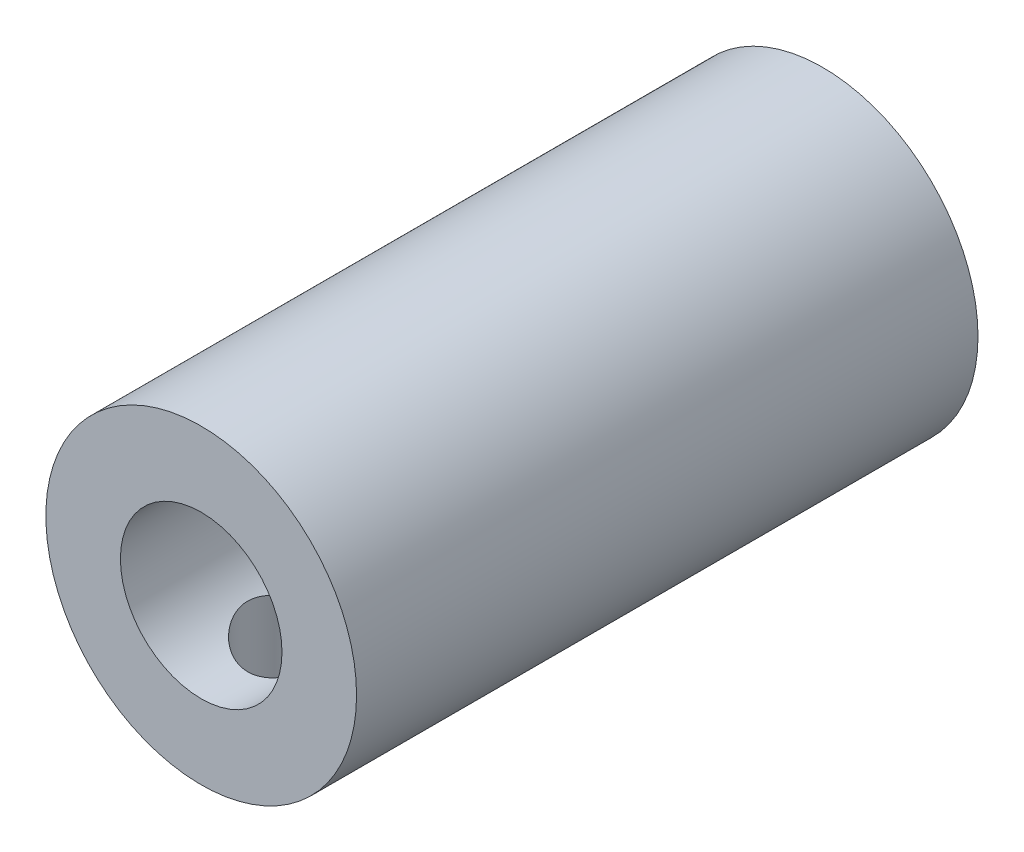
ISO-10303-21;
HEADER;
FILE_DESCRIPTION(('STEP AP214'),'2;1');
FILE_NAME('part.step','',(''),(''),'','','');
FILE_SCHEMA(('AUTOMOTIVE_DESIGN { 1 0 10303 214 1 1 1 1 }'));
ENDSEC;
DATA;
#1=APPLICATION_CONTEXT('core data for automotive mechanical design processes');
#2=APPLICATION_PROTOCOL_DEFINITION('international standard','automotive_design',2000,#1);
#3=PRODUCT_CONTEXT('',#1,'mechanical');
#4=PRODUCT('Part','Part','',(#3));
#5=PRODUCT_RELATED_PRODUCT_CATEGORY('part','',(#4));
#6=PRODUCT_DEFINITION_FORMATION('','',#4);
#7=PRODUCT_DEFINITION_CONTEXT('part definition',#1,'design');
#8=PRODUCT_DEFINITION('design','',#6,#7);
#9=PRODUCT_DEFINITION_SHAPE('','',#8);
#10=(LENGTH_UNIT() NAMED_UNIT(*) SI_UNIT(.MILLI.,.METRE.));
#11=(NAMED_UNIT(*) PLANE_ANGLE_UNIT() SI_UNIT($,.RADIAN.));
#12=(NAMED_UNIT(*) SI_UNIT($,.STERADIAN.) SOLID_ANGLE_UNIT());
#13=UNCERTAINTY_MEASURE_WITH_UNIT(LENGTH_MEASURE(1.E-05),#10,'distance_accuracy_value','');
#14=(GEOMETRIC_REPRESENTATION_CONTEXT(3) GLOBAL_UNCERTAINTY_ASSIGNED_CONTEXT((#13)) GLOBAL_UNIT_ASSIGNED_CONTEXT((#10,
#11,#12)) REPRESENTATION_CONTEXT('',''));
#15=CARTESIAN_POINT('',(0.,0.,0.));
#16=DIRECTION('',(0.,0.,1.));
#17=DIRECTION('',(1.,0.,0.));
#18=AXIS2_PLACEMENT_3D('',#15,#16,#17);
#19=CARTESIAN_POINT('',(0.,0.,20.));
#20=DIRECTION('',(0.,0.,-1.));
#21=DIRECTION('',(-1.,0.,0.));
#22=AXIS2_PLACEMENT_3D('',#19,#20,#21);
#23=CYLINDRICAL_SURFACE('',#22,10.);
#24=CARTESIAN_POINT('',(0.,-10.,-11.));
#25=CARTESIAN_POINT('',(0.164577225506601,-9.999998585011,-11.0000019949698));
#26=CARTESIAN_POINT('',(0.32917463670306,-9.99589831387907,-11.0135877272479));
#27=CARTESIAN_POINT('',(0.653576250609762,-9.97994211187382,-11.0674427084442));
#28=CARTESIAN_POINT('',(0.813379008822841,-9.96808386779384,-11.1077199160467));
#29=CARTESIAN_POINT('',(1.12346541550905,-9.93791105003673,-11.2134920338205));
#30=CARTESIAN_POINT('',(1.27376272879075,-9.91960600500851,-11.2789497392379));
#31=CARTESIAN_POINT('',(1.56124836210626,-9.87844218475291,-11.4330721861117));
#32=CARTESIAN_POINT('',(1.69843493493934,-9.85558280384133,-11.5217400147908));
#33=CARTESIAN_POINT('',(1.95974359436749,-9.80701474385548,-11.7224480149453));
#34=CARTESIAN_POINT('',(2.08343614248868,-9.78124767314073,-11.8350332517718));
#35=CARTESIAN_POINT('',(2.31049841846648,-9.73011668420884,-12.0792184598204));
#36=CARTESIAN_POINT('',(2.41386472654882,-9.70475283449003,-12.2108216242499));
#37=CARTESIAN_POINT('',(2.59960075447415,-9.65668227987544,-12.4929415060752));
#38=CARTESIAN_POINT('',(2.68144618044427,-9.63404813327749,-12.6438169219815));
#39=CARTESIAN_POINT('',(2.81842789549521,-9.59487240788062,-12.9579785084606));
#40=CARTESIAN_POINT('',(2.87357059839947,-9.57832936626621,-13.121261687856));
#41=CARTESIAN_POINT('',(2.95403267365303,-9.55381741676868,-13.4507805322609));
#42=CARTESIAN_POINT('',(2.98014392469355,-9.54562138649067,-13.6168054877279));
#43=CARTESIAN_POINT('',(3.00427461229344,-9.53805579499534,-13.9510663124335));
#44=CARTESIAN_POINT('',(3.00230085522157,-9.53868409521142,-14.1193016361182));
#45=CARTESIAN_POINT('',(2.97093954399623,-9.54849488135555,-14.446767817217));
#46=CARTESIAN_POINT('',(2.9425441052537,-9.55736777198281,-14.6061045007245));
#47=CARTESIAN_POINT('',(2.86074840854112,-9.58216712457248,-14.9176395725469));
#48=CARTESIAN_POINT('',(2.80734568283282,-9.59809428264701,-15.0698372547487));
#49=CARTESIAN_POINT('',(2.67632053307363,-9.63545466149946,-15.3652006993215));
#50=CARTESIAN_POINT('',(2.59837633869285,-9.65696032231904,-15.5082141679105));
#51=CARTESIAN_POINT('',(2.42070445177367,-9.70301974000129,-15.7794640440204));
#52=CARTESIAN_POINT('',(2.32097148005177,-9.72757423493982,-15.9076968588276));
#53=CARTESIAN_POINT('',(2.09762581531093,-9.77822022595875,-16.151372381524));
#54=CARTESIAN_POINT('',(1.97318981493395,-9.80433308620996,-16.2660573280593));
#55=CARTESIAN_POINT('',(1.70652651862793,-9.85424488126517,-16.4731079681285));
#56=CARTESIAN_POINT('',(1.56429810372178,-9.8780436703682,-16.5654722568289));
#57=CARTESIAN_POINT('',(1.26471007668561,-9.92086320138941,-16.7257198449295));
#58=CARTESIAN_POINT('',(1.1072554994959,-9.93985087336628,-16.7934350324997));
#59=CARTESIAN_POINT('',(0.782490831207039,-9.97067043664444,-16.9011991801993));
#60=CARTESIAN_POINT('',(0.615183503179163,-9.98250432373999,-16.941255857065));
#61=CARTESIAN_POINT('',(0.281904485336663,-9.99736729287077,-16.9913043557988));
#62=CARTESIAN_POINT('',(0.116100195202374,-10.0006970083558,-17.0023231716032));
#63=CARTESIAN_POINT('',(-0.214999211646766,-9.99905846483519,-16.9968616885758));
#64=CARTESIAN_POINT('',(-0.380294393381561,-9.99409131355514,-16.9803850606971));
#65=CARTESIAN_POINT('',(-0.701807210619393,-9.97661393974325,-16.921230777777));
#66=CARTESIAN_POINT('',(-0.858145545228338,-9.96427659598829,-16.8791532248383));
#67=CARTESIAN_POINT('',(-1.16150927790904,-9.9334869568307,-16.7707135344436));
#68=CARTESIAN_POINT('',(-1.30853355405117,-9.91503392642188,-16.7043484779243));
#69=CARTESIAN_POINT('',(-1.5928743789221,-9.87339308702631,-16.5474936690377));
#70=CARTESIAN_POINT('',(-1.72988765239934,-9.8501056165928,-16.456481318104));
#71=CARTESIAN_POINT('',(-1.9870466159603,-9.80146937528705,-16.2535504918944));
#72=CARTESIAN_POINT('',(-2.10718806471188,-9.7761200886242,-16.1416267762247));
#73=CARTESIAN_POINT('',(-2.33171489102052,-9.72506343738007,-15.8952253832613));
#74=CARTESIAN_POINT('',(-2.43536962463001,-9.69937650065513,-15.7600762484563));
#75=CARTESIAN_POINT('',(-2.61857990144313,-9.65153030477949,-15.4737441219731));
#76=CARTESIAN_POINT('',(-2.69813607658965,-9.62937095313121,-15.3225615508842));
#77=CARTESIAN_POINT('',(-2.83034694254316,-9.5913437922631,-15.00893501749));
#78=CARTESIAN_POINT('',(-2.88312693874021,-9.575446756735,-14.8465476269243));
#79=CARTESIAN_POINT('',(-2.96043461630306,-9.55183188739737,-14.5146240621395));
#80=CARTESIAN_POINT('',(-2.98497197957849,-9.54411125069387,-14.3450903584339));
#81=CARTESIAN_POINT('',(-3.0044396896993,-9.53799944941558,-14.0112769632232));
#82=CARTESIAN_POINT('',(-3.00056110615887,-9.53923294700395,-13.8470726979012));
#83=CARTESIAN_POINT('',(-2.9661501088861,-9.54998802392189,-13.5217717931988));
#84=CARTESIAN_POINT('',(-2.93561876249407,-9.55950927135902,-13.360675029639));
#85=CARTESIAN_POINT('',(-2.84953777608686,-9.58551527389243,-13.0481092017367));
#86=CARTESIAN_POINT('',(-2.79430351014248,-9.60191209104934,-12.8965454252826));
#87=CARTESIAN_POINT('',(-2.66063014242147,-9.63980557805265,-12.6047151223586));
#88=CARTESIAN_POINT('',(-2.58218659925722,-9.6613032238508,-12.4644507647169));
#89=CARTESIAN_POINT('',(-2.40097527610175,-9.70795352855338,-12.1936737669475));
#90=CARTESIAN_POINT('',(-2.29742552185996,-9.7332108032858,-12.0637024774796));
#91=CARTESIAN_POINT('',(-2.07034869259555,-9.78402640899066,-11.8225950033838));
#92=CARTESIAN_POINT('',(-1.94681643426898,-9.80958481647543,-11.7114637210644));
#93=CARTESIAN_POINT('',(-1.67893152436652,-9.85901873141573,-11.5079531754101));
#94=CARTESIAN_POINT('',(-1.53407577158122,-9.88282319531421,-11.4162171062891));
#95=CARTESIAN_POINT('',(-1.23028274796705,-9.92521360911553,-11.2585296601919));
#96=CARTESIAN_POINT('',(-1.07135210599791,-9.94380199862114,-11.192566223451));
#97=CARTESIAN_POINT('',(-0.761515425310561,-9.97204349938619,-11.0942094486945));
#98=CARTESIAN_POINT('',(-0.611573923908466,-9.9824405476214,-11.0589766542335));
#99=CARTESIAN_POINT('',(-0.307760390461556,-9.9964188898898,-11.0118729495168));
#100=CARTESIAN_POINT('',(-0.153889019716277,-10.0000013230948,-10.9999981345904));
#101=CARTESIAN_POINT('',(0.,-10.,-11.));
#102=B_SPLINE_CURVE_WITH_KNOTS('',3,(#24,#25,#26,#27,#28,#29,#30,#31,#32,#33,#34,#35,#36,#37,
#38,#39,#40,#41,#42,#43,#44,#45,#46,#47,#48,#49,#50,#51,#52,#53,#54,#55,#56,#57,#58,#59,#60,#61,
#62,#63,#64,#65,#66,#67,#68,#69,#70,#71,#72,#73,#74,#75,#76,#77,#78,#79,#80,#81,#82,#83,#84,#85,
#86,#87,#88,#89,#90,#91,#92,#93,#94,#95,#96,#97,#98,#99,#100,#101),.UNSPECIFIED.,.T.,.F.,(4,2,2,
2,2,2,2,2,2,2,2,2,2,2,2,2,2,2,2,2,2,2,2,2,2,2,2,2,2,2,2,2,2,2,2,2,2,2,4),(0.,0.493166407225221,
0.986479929691999,1.47906735260175,1.9717203288254,2.47711205896383,2.98258874577266,
3.49942962008218,4.01614629086447,4.51839378713198,5.02051956638179,5.50452033395352,
5.98856887316003,6.47924852894239,6.97004720317111,7.48134208096333,7.99266913062143,
8.50742093763377,9.02202907057615,9.5181761887709,10.0142570710065,10.4991349336465,
10.9840710918746,11.4802261140582,11.9765056400038,12.4908080064564,13.0050968850536,
13.516956299025,14.0286401892057,14.5190031093854,15.0093463933232,15.4936008081456,
15.9779479511534,16.4799385136898,16.9820594980413,17.4988599232246,18.0154182319959,
18.4766338387004,18.9377723390687),.UNSPECIFIED.);
#103=CARTESIAN_POINT('',(0.,-10.,-11.));
#104=VERTEX_POINT('',#103);
#105=EDGE_CURVE('E100',#104,#104,#102,.T.);
#106=ORIENTED_EDGE('',*,*,#105,.T.);
#107=EDGE_LOOP('',(#106));
#108=FACE_BOUND('',#107,.T.);
#109=CARTESIAN_POINT('',(0.,-10.,17.));
#110=CARTESIAN_POINT('',(0.164577225506604,-9.999998585011,16.9999980050302));
#111=CARTESIAN_POINT('',(0.329174636703063,-9.99589831387907,16.9864122727521));
#112=CARTESIAN_POINT('',(0.653576250609766,-9.97994211187382,16.9325572915558));
#113=CARTESIAN_POINT('',(0.813379008822844,-9.96808386779384,16.8922800839533));
#114=CARTESIAN_POINT('',(1.12346541550906,-9.93791105003673,16.7865079661795));
#115=CARTESIAN_POINT('',(1.27376272879075,-9.91960600500851,16.7210502607621));
#116=CARTESIAN_POINT('',(1.56124836210627,-9.8784421847529,16.5669278138883));
#117=CARTESIAN_POINT('',(1.69843493493934,-9.85558280384133,16.4782599852092));
#118=CARTESIAN_POINT('',(1.95974359436749,-9.80701474385548,16.2775519850547));
#119=CARTESIAN_POINT('',(2.08343614248869,-9.78124767314073,16.1649667482282));
#120=CARTESIAN_POINT('',(2.31049841846648,-9.73011668420884,15.9207815401796));
#121=CARTESIAN_POINT('',(2.41386472654882,-9.70475283449003,15.7891783757501));
#122=CARTESIAN_POINT('',(2.59960075447416,-9.65668227987544,15.5070584939248));
#123=CARTESIAN_POINT('',(2.68144618044427,-9.63404813327749,15.3561830780185));
#124=CARTESIAN_POINT('',(2.81842789549521,-9.59487240788062,15.0420214915394));
#125=CARTESIAN_POINT('',(2.87357059839947,-9.57832936626621,14.8787383121441));
#126=CARTESIAN_POINT('',(2.95403267365304,-9.55381741676868,14.5492194677391));
#127=CARTESIAN_POINT('',(2.98014392469355,-9.54562138649066,14.3831945122721));
#128=CARTESIAN_POINT('',(3.00427461229344,-9.53805579499534,14.0489336875665));
#129=CARTESIAN_POINT('',(3.00230085522157,-9.53868409521142,13.8806983638818));
#130=CARTESIAN_POINT('',(2.97093954399624,-9.54849488135555,13.553232182783));
#131=CARTESIAN_POINT('',(2.94254410525371,-9.55736777198281,13.3938954992755));
#132=CARTESIAN_POINT('',(2.86074840854112,-9.58216712457248,13.0823604274531));
#133=CARTESIAN_POINT('',(2.80734568283282,-9.59809428264701,12.9301627452513));
#134=CARTESIAN_POINT('',(2.67632053307364,-9.63545466149946,12.6347993006785));
#135=CARTESIAN_POINT('',(2.59837633869285,-9.65696032231904,12.4917858320895));
#136=CARTESIAN_POINT('',(2.42070445177367,-9.70301974000129,12.2205359559796));
#137=CARTESIAN_POINT('',(2.32097148005177,-9.72757423493982,12.0923031411724));
#138=CARTESIAN_POINT('',(2.09762581531093,-9.77822022595874,11.848627618476));
#139=CARTESIAN_POINT('',(1.97318981493395,-9.80433308620995,11.7339426719407));
#140=CARTESIAN_POINT('',(1.70652651862794,-9.85424488126517,11.5268920318715));
#141=CARTESIAN_POINT('',(1.56429810372178,-9.8780436703682,11.4345277431711));
#142=CARTESIAN_POINT('',(1.26471007668561,-9.92086320138941,11.2742801550705));
#143=CARTESIAN_POINT('',(1.1072554994959,-9.93985087336628,11.2065649675003));
#144=CARTESIAN_POINT('',(0.782490831207043,-9.97067043664444,11.0988008198007));
#145=CARTESIAN_POINT('',(0.615183503179168,-9.98250432373999,11.058744142935));
#146=CARTESIAN_POINT('',(0.281904485336668,-9.99736729287077,11.0086956442012));
#147=CARTESIAN_POINT('',(0.116100195202379,-10.0006970083558,10.9976768283968));
#148=CARTESIAN_POINT('',(-0.214999211646761,-9.99905846483519,11.0031383114242));
#149=CARTESIAN_POINT('',(-0.380294393381557,-9.99409131355514,11.0196149393029));
#150=CARTESIAN_POINT('',(-0.701807210619389,-9.97661393974325,11.078769222223));
#151=CARTESIAN_POINT('',(-0.858145545228334,-9.96427659598829,11.1208467751617));
#152=CARTESIAN_POINT('',(-1.16150927790904,-9.9334869568307,11.2292864655564));
#153=CARTESIAN_POINT('',(-1.30853355405116,-9.91503392642188,11.2956515220757));
#154=CARTESIAN_POINT('',(-1.5928743789221,-9.87339308702631,11.4525063309623));
#155=CARTESIAN_POINT('',(-1.72988765239933,-9.8501056165928,11.543518681896));
#156=CARTESIAN_POINT('',(-1.98704661596029,-9.80146937528705,11.7464495081056));
#157=CARTESIAN_POINT('',(-2.10718806471188,-9.7761200886242,11.8583732237753));
#158=CARTESIAN_POINT('',(-2.33171489102052,-9.72506343738007,12.1047746167387));
#159=CARTESIAN_POINT('',(-2.43536962463001,-9.69937650065513,12.2399237515437));
#160=CARTESIAN_POINT('',(-2.61857990144312,-9.65153030477949,12.5262558780269));
#161=CARTESIAN_POINT('',(-2.69813607658964,-9.62937095313121,12.6774384491158));
#162=CARTESIAN_POINT('',(-2.83034694254315,-9.5913437922631,12.99106498251));
#163=CARTESIAN_POINT('',(-2.88312693874021,-9.57544675673501,13.1534523730757));
#164=CARTESIAN_POINT('',(-2.96043461630306,-9.55183188739737,13.4853759378605));
#165=CARTESIAN_POINT('',(-2.98497197957848,-9.54411125069387,13.6549096415661));
#166=CARTESIAN_POINT('',(-3.0044396896993,-9.53799944941558,13.9887230367768));
#167=CARTESIAN_POINT('',(-3.00056110615886,-9.53923294700395,14.1529273020988));
#168=CARTESIAN_POINT('',(-2.9661501088861,-9.54998802392189,14.4782282068012));
#169=CARTESIAN_POINT('',(-2.93561876249407,-9.55950927135902,14.639324970361));
#170=CARTESIAN_POINT('',(-2.84953777608685,-9.58551527389243,14.9518907982634));
#171=CARTESIAN_POINT('',(-2.79430351014247,-9.60191209104934,15.1034545747174));
#172=CARTESIAN_POINT('',(-2.66063014242147,-9.63980557805265,15.3952848776415));
#173=CARTESIAN_POINT('',(-2.58218659925722,-9.6613032238508,15.5355492352832));
#174=CARTESIAN_POINT('',(-2.40097527610175,-9.70795352855338,15.8063262330525));
#175=CARTESIAN_POINT('',(-2.29742552185995,-9.7332108032858,15.9362975225204));
#176=CARTESIAN_POINT('',(-2.07034869259555,-9.78402640899066,16.1774049966162));
#177=CARTESIAN_POINT('',(-1.94681643426897,-9.80958481647543,16.2885362789356));
#178=CARTESIAN_POINT('',(-1.67893152436651,-9.85901873141573,16.4920468245899));
#179=CARTESIAN_POINT('',(-1.53407577158121,-9.88282319531422,16.5837828937109));
#180=CARTESIAN_POINT('',(-1.23028274796705,-9.92521360911553,16.7414703398081));
#181=CARTESIAN_POINT('',(-1.0713521059979,-9.94380199862114,16.807433776549));
#182=CARTESIAN_POINT('',(-0.76151542531056,-9.97204349938619,16.9057905513055));
#183=CARTESIAN_POINT('',(-0.611573923908465,-9.9824405476214,16.9410233457665));
#184=CARTESIAN_POINT('',(-0.307760390461554,-9.9964188898898,16.9881270504832));
#185=CARTESIAN_POINT('',(-0.153889019716275,-10.0000013230948,17.0000018654096));
#186=CARTESIAN_POINT('',(0.,-10.,17.));
#187=B_SPLINE_CURVE_WITH_KNOTS('',3,(#109,#110,#111,#112,#113,#114,#115,#116,#117,#118,#119,
#120,#121,#122,#123,#124,#125,#126,#127,#128,#129,#130,#131,#132,#133,#134,#135,#136,#137,#138,
#139,#140,#141,#142,#143,#144,#145,#146,#147,#148,#149,#150,#151,#152,#153,#154,#155,#156,#157,
#158,#159,#160,#161,#162,#163,#164,#165,#166,#167,#168,#169,#170,#171,#172,#173,#174,#175,#176,
#177,#178,#179,#180,#181,#182,#183,#184,#185,#186),.UNSPECIFIED.,.T.,.F.,(4,2,2,2,2,2,2,2,2,2,2,
2,2,2,2,2,2,2,2,2,2,2,2,2,2,2,2,2,2,2,2,2,2,2,2,2,2,2,4),(0.,0.493166407225221,
0.986479929691998,1.47906735260175,1.97172032882541,2.47711205896383,2.98258874577266,
3.49942962008218,4.01614629086447,4.51839378713198,5.02051956638179,5.50452033395352,
5.98856887316003,6.47924852894239,6.97004720317111,7.48134208096333,7.99266913062143,
8.50742093763377,9.02202907057615,9.5181761887709,10.0142570710065,10.4991349336465,
10.9840710918746,11.4802261140582,11.9765056400038,12.4908080064564,13.0050968850536,
13.516956299025,14.0286401892057,14.5190031093854,15.0093463933232,15.4936008081456,
15.9779479511534,16.4799385136898,16.9820594980413,17.4988599232246,18.0154182319959,
18.4766338387004,18.9377723390687),.UNSPECIFIED.);
#188=CARTESIAN_POINT('',(0.,-10.,17.));
#189=VERTEX_POINT('',#188);
#190=EDGE_CURVE('E82',#189,#189,#187,.T.);
#191=ORIENTED_EDGE('',*,*,#190,.T.);
#192=EDGE_LOOP('',(#191));
#193=FACE_BOUND('',#192,.T.);
#194=CARTESIAN_POINT('',(0.,0.,20.));
#195=DIRECTION('',(0.,0.,1.));
#196=DIRECTION('',(1.,0.,0.));
#197=AXIS2_PLACEMENT_3D('',#194,#195,#196);
#198=CIRCLE('',#197,10.);
#199=CARTESIAN_POINT('',(10.,0.,20.));
#200=VERTEX_POINT('',#199);
#201=EDGE_CURVE('E10',#200,#200,#198,.T.);
#202=ORIENTED_EDGE('',*,*,#201,.F.);
#203=EDGE_LOOP('',(#202));
#204=FACE_BOUND('',#203,.T.);
#205=CARTESIAN_POINT('',(0.,0.,-20.));
#206=DIRECTION('',(0.,0.,1.));
#207=DIRECTION('',(1.,0.,0.));
#208=AXIS2_PLACEMENT_3D('',#205,#206,#207);
#209=CIRCLE('',#208,10.);
#210=CARTESIAN_POINT('',(10.,0.,-20.));
#211=VERTEX_POINT('',#210);
#212=EDGE_CURVE('E55',#211,#211,#209,.T.);
#213=ORIENTED_EDGE('',*,*,#212,.T.);
#214=EDGE_LOOP('',(#213));
#215=FACE_BOUND('',#214,.T.);
#216=ADVANCED_FACE('F41',(#108,#193,#204,#215),#23,.T.);
#217=CARTESIAN_POINT('',(0.,0.,20.));
#218=DIRECTION('',(0.,0.,1.));
#219=DIRECTION('',(1.,0.,0.));
#220=AXIS2_PLACEMENT_3D('',#217,#218,#219);
#221=PLANE('',#220);
#222=CARTESIAN_POINT('',(0.,0.,20.));
#223=DIRECTION('',(0.,0.,1.));
#224=DIRECTION('',(1.,0.,0.));
#225=AXIS2_PLACEMENT_3D('',#222,#223,#224);
#226=CIRCLE('',#225,5.2);
#227=CARTESIAN_POINT('',(5.2,0.,20.));
#228=VERTEX_POINT('',#227);
#229=EDGE_CURVE('E70',#228,#228,#226,.F.);
#230=ORIENTED_EDGE('',*,*,#229,.T.);
#231=EDGE_LOOP('',(#230));
#232=FACE_BOUND('',#231,.T.);
#233=ORIENTED_EDGE('',*,*,#201,.T.);
#234=EDGE_LOOP('',(#233));
#235=FACE_BOUND('',#234,.T.);
#236=ADVANCED_FACE('F122',(#232,#235),#221,.T.);
#237=CARTESIAN_POINT('',(0.,0.,-20.));
#238=DIRECTION('',(0.,0.,1.));
#239=DIRECTION('',(1.,0.,0.));
#240=AXIS2_PLACEMENT_3D('',#237,#238,#239);
#241=PLANE('',#240);
#242=CARTESIAN_POINT('',(0.,0.,-20.));
#243=DIRECTION('',(0.,0.,1.));
#244=DIRECTION('',(1.,0.,0.));
#245=AXIS2_PLACEMENT_3D('',#242,#243,#244);
#246=CIRCLE('',#245,8.);
#247=CARTESIAN_POINT('',(8.,0.,-20.));
#248=VERTEX_POINT('',#247);
#249=EDGE_CURVE('E61',#248,#248,#246,.T.);
#250=ORIENTED_EDGE('',*,*,#249,.T.);
#251=EDGE_LOOP('',(#250));
#252=FACE_BOUND('',#251,.T.);
#253=ORIENTED_EDGE('',*,*,#212,.F.);
#254=EDGE_LOOP('',(#253));
#255=FACE_BOUND('',#254,.T.);
#256=ADVANCED_FACE('F127',(#252,#255),#241,.F.);
#257=CARTESIAN_POINT('',(0.,0.,-25.));
#258=DIRECTION('',(0.,0.,1.));
#259=DIRECTION('',(1.,0.,0.));
#260=AXIS2_PLACEMENT_3D('',#257,#258,#259);
#261=CYLINDRICAL_SURFACE('',#260,8.);
#262=CARTESIAN_POINT('',(0.,-8.,-11.));
#263=CARTESIAN_POINT('',(-0.162470117875705,-8.00000434912302,-10.9999941953938));
#264=CARTESIAN_POINT('',(-0.324900483563583,-7.99500758566368,-11.0132395204968));
#265=CARTESIAN_POINT('',(-0.644906904704721,-7.97557392013855,-11.0656563905399));
#266=CARTESIAN_POINT('',(-0.802483655975231,-7.96113837787987,-11.1048242009411));
#267=CARTESIAN_POINT('',(-1.10812156998176,-7.92437664783088,-11.2075060035435));
#268=CARTESIAN_POINT('',(-1.25620044832455,-7.90206568698877,-11.2709730336436));
#269=CARTESIAN_POINT('',(-1.53959862032051,-7.85177535530709,-11.4202128260316));
#270=CARTESIAN_POINT('',(-1.67491447835576,-7.82379446455107,-11.5059915710883));
#271=CARTESIAN_POINT('',(-1.93469283409165,-7.76372493942421,-11.7012250621418));
#272=CARTESIAN_POINT('',(-2.05854146030237,-7.73152005167087,-11.8114605245188));
#273=CARTESIAN_POINT('',(-2.28648842948728,-7.66720441742698,-12.0508208693177));
#274=CARTESIAN_POINT('',(-2.39058072718411,-7.63509370270232,-12.1799515121756));
#275=CARTESIAN_POINT('',(-2.57996404431964,-7.5732494123529,-12.4594349350465));
#276=CARTESIAN_POINT('',(-2.66438786391495,-7.5436529764098,-12.6104087330921));
#277=CARTESIAN_POINT('',(-2.80637292668193,-7.49199720475523,-12.9256967083366));
#278=CARTESIAN_POINT('',(-2.86394489922567,-7.46993485954215,-13.0900055263085));
#279=CARTESIAN_POINT('',(-2.94816862035013,-7.4370882564592,-13.4202334805181));
#280=CARTESIAN_POINT('',(-2.97599186436803,-7.42587848693063,-13.585810076877));
#281=CARTESIAN_POINT('',(-3.00359113063608,-7.41476122931038,-13.9196323159816));
#282=CARTESIAN_POINT('',(-3.00337873606425,-7.41484907350686,-14.0878768277263));
#283=CARTESIAN_POINT('',(-2.97580859218857,-7.42595023233986,-14.4115390504571));
#284=CARTESIAN_POINT('',(-2.95007617013711,-7.43630937632964,-14.5671218121852));
#285=CARTESIAN_POINT('',(-2.87488335732475,-7.46569876010067,-14.8715743009025));
#286=CARTESIAN_POINT('',(-2.82541939325577,-7.48473030568195,-15.020443013249));
#287=CARTESIAN_POINT('',(-2.70327497145115,-7.52971404410467,-15.3105541354265));
#288=CARTESIAN_POINT('',(-2.63017297474552,-7.55579035984378,-15.4515989722346));
#289=CARTESIAN_POINT('',(-2.46312147525044,-7.61188420270589,-15.71989147519));
#290=CARTESIAN_POINT('',(-2.36916477457696,-7.64190308912094,-15.8471343550416));
#291=CARTESIAN_POINT('',(-2.15563561533201,-7.70496077720597,-16.0932073272994));
#292=CARTESIAN_POINT('',(-2.03476597433939,-7.73806694911977,-16.2108972814956));
#293=CARTESIAN_POINT('',(-1.77462518163776,-7.80183456327535,-16.4246759324122));
#294=CARTESIAN_POINT('',(-1.63535120699465,-7.83249562931733,-16.5207613092115));
#295=CARTESIAN_POINT('',(-1.33944687398491,-7.88852789618334,-16.6898607941249));
#296=CARTESIAN_POINT('',(-1.18258142768946,-7.91380996519279,-16.7624951624421));
#297=CARTESIAN_POINT('',(-0.857673701049144,-7.95557436653878,-16.8799652085401));
#298=CARTESIAN_POINT('',(-0.689636421691527,-7.97206060682974,-16.9248132331223));
#299=CARTESIAN_POINT('',(-0.356750486297334,-7.99368886456142,-16.9832455750839));
#300=CARTESIAN_POINT('',(-0.192207239124418,-7.99938738051376,-16.998365212765));
#301=CARTESIAN_POINT('',(0.137144950510052,-8.00051787400248,-17.0013821277998));
#302=CARTESIAN_POINT('',(0.301953825966748,-7.99595212773726,-16.9892854406336));
#303=CARTESIAN_POINT('',(0.620524097123721,-7.97743419545287,-16.9393799153827));
#304=CARTESIAN_POINT('',(0.774466656014675,-7.9638494192461,-16.9025769125258));
#305=CARTESIAN_POINT('',(1.07388350991444,-7.92902954183434,-16.8056278549054));
#306=CARTESIAN_POINT('',(1.21935670069507,-7.9077934456406,-16.7454787641039));
#307=CARTESIAN_POINT('',(1.50249553022031,-7.85899248815363,-16.601627175121));
#308=CARTESIAN_POINT('',(1.63980616711559,-7.83126000418696,-16.5172845415532));
#309=CARTESIAN_POINT('',(1.89878542345325,-7.77253343129328,-16.3281637936569));
#310=CARTESIAN_POINT('',(2.0204482405409,-7.74153814019032,-16.2233781349097));
#311=CARTESIAN_POINT('',(2.25206159748909,-7.67746658981979,-15.9891917557515));
#312=CARTESIAN_POINT('',(2.36092308247137,-7.64437393007459,-15.8587156344546));
#313=CARTESIAN_POINT('',(2.55542100063807,-7.58157631493707,-15.5806972305847));
#314=CARTESIAN_POINT('',(2.64105534829037,-7.55187166388799,-15.433153417223));
#315=CARTESIAN_POINT('',(2.78675547037995,-7.49933659644926,-15.1239680264554));
#316=CARTESIAN_POINT('',(2.84671370893836,-7.47653520656987,-14.9622705081791));
#317=CARTESIAN_POINT('',(2.93815766933778,-7.4410806578201,-14.6299804726244));
#318=CARTESIAN_POINT('',(2.9696610061107,-7.42842122114981,-14.4593935276038));
#319=CARTESIAN_POINT('',(3.00172694195678,-7.41551789585147,-14.1259676809178));
#320=CARTESIAN_POINT('',(3.00414662991675,-7.41452889046682,-13.9633347365662));
#321=CARTESIAN_POINT('',(2.98273431283185,-7.42316825490584,-13.6401093674477));
#322=CARTESIAN_POINT('',(2.95890479700247,-7.43279561797798,-13.4795167506568));
#323=CARTESIAN_POINT('',(2.88711631260483,-7.46096283170865,-13.1699055465669));
#324=CARTESIAN_POINT('',(2.83991596633048,-7.47922170753326,-13.0206833075093));
#325=CARTESIAN_POINT('',(2.72339393559839,-7.52243096595689,-12.7321889830112));
#326=CARTESIAN_POINT('',(2.65406665889889,-7.54738303990429,-12.5929194238597));
#327=CARTESIAN_POINT('',(2.49104151876307,-7.60279447807929,-12.3203464206047));
#328=CARTESIAN_POINT('',(2.3962566560602,-7.63347396881928,-12.1877384064002));
#329=CARTESIAN_POINT('',(2.18668971459812,-7.69612493514354,-11.9397168780576));
#330=CARTESIAN_POINT('',(2.07190128025617,-7.7280968188629,-11.8243088504265));
#331=CARTESIAN_POINT('',(1.81816079356925,-7.79180849219762,-11.6075960883563));
#332=CARTESIAN_POINT('',(1.67823728842599,-7.82344209801289,-11.5073924931307));
#333=CARTESIAN_POINT('',(1.38242644640164,-7.88109028914061,-11.3319546894469));
#334=CARTESIAN_POINT('',(1.22653786818124,-7.90710443703118,-11.2567224245273));
#335=CARTESIAN_POINT('',(0.895998164004625,-7.9514858521336,-11.1312463419033));
#336=CARTESIAN_POINT('',(0.720826844468417,-7.96947314316712,-11.0822258707962));
#337=CARTESIAN_POINT('',(0.363751467212765,-7.99372484359173,-11.0166140801586));
#338=CARTESIAN_POINT('',(0.181850832729719,-7.99999513207934,-11.0000064970254));
#339=CARTESIAN_POINT('',(0.,-8.,-11.));
#340=B_SPLINE_CURVE_WITH_KNOTS('',3,(#262,#263,#264,#265,#266,#267,#268,#269,#270,#271,#272,
#273,#274,#275,#276,#277,#278,#279,#280,#281,#282,#283,#284,#285,#286,#287,#288,#289,#290,#291,
#292,#293,#294,#295,#296,#297,#298,#299,#300,#301,#302,#303,#304,#305,#306,#307,#308,#309,#310,
#311,#312,#313,#314,#315,#316,#317,#318,#319,#320,#321,#322,#323,#324,#325,#326,#327,#328,#329,
#330,#331,#332,#333,#334,#335,#336,#337,#338,#339),.UNSPECIFIED.,.T.,.F.,(4,2,2,2,2,2,2,2,2,2,2,
2,2,2,2,2,2,2,2,2,2,2,2,2,2,2,2,2,2,2,2,2,2,2,2,2,2,2,4),(0.,0.48673960312112,0.973409099060921,
1.45914273842715,1.94500675921898,2.44947237165431,2.95409209851243,3.47793349003317,
4.00156538704268,4.50371748833803,5.00566212159415,5.47756690242935,5.94954276126852,
6.43044816779711,6.91151981494191,7.424923066773,7.93840515815806,8.45982750577825,
8.98101799403366,9.47450039277525,9.96787336786715,10.4422887585335,10.9167658651458,
11.4051844372487,11.8937836004541,12.4107303891699,12.9277235784596,13.4468613346008,
13.9656774991869,14.4511752696618,14.9366270042819,15.4072628485874,15.8780177331869,
16.3734494377422,16.869038839998,17.3914465931375,17.9138949961588,18.4589703006976,
19.0037720359793),.UNSPECIFIED.);
#341=CARTESIAN_POINT('',(0.,-8.,-11.));
#342=VERTEX_POINT('',#341);
#343=EDGE_CURVE('E45',#342,#342,#340,.T.);
#344=ORIENTED_EDGE('',*,*,#343,.T.);
#345=EDGE_LOOP('',(#344));
#346=FACE_BOUND('',#345,.T.);
#347=CARTESIAN_POINT('',(0.,0.,0.));
#348=DIRECTION('',(0.,0.,1.));
#349=DIRECTION('',(1.,0.,0.));
#350=AXIS2_PLACEMENT_3D('',#347,#348,#349);
#351=CIRCLE('',#350,8.);
#352=CARTESIAN_POINT('',(8.,0.,0.));
#353=VERTEX_POINT('',#352);
#354=EDGE_CURVE('E64',#353,#353,#351,.T.);
#355=ORIENTED_EDGE('',*,*,#354,.T.);
#356=EDGE_LOOP('',(#355));
#357=FACE_BOUND('',#356,.T.);
#358=ORIENTED_EDGE('',*,*,#249,.F.);
#359=EDGE_LOOP('',(#358));
#360=FACE_BOUND('',#359,.T.);
#361=ADVANCED_FACE('F118',(#346,#357,#360),#261,.F.);
#362=CARTESIAN_POINT('',(0.,0.,0.));
#363=DIRECTION('',(0.,0.,1.));
#364=DIRECTION('',(1.,0.,0.));
#365=AXIS2_PLACEMENT_3D('',#362,#363,#364);
#366=PLANE('',#365);
#367=CARTESIAN_POINT('',(0.,0.,0.));
#368=DIRECTION('',(0.,0.,1.));
#369=DIRECTION('',(1.,0.,0.));
#370=AXIS2_PLACEMENT_3D('',#367,#368,#369);
#371=CIRCLE('',#370,5.2);
#372=CARTESIAN_POINT('',(5.2,0.,0.));
#373=VERTEX_POINT('',#372);
#374=EDGE_CURVE('E73',#373,#373,#371,.T.);
#375=ORIENTED_EDGE('',*,*,#374,.T.);
#376=EDGE_LOOP('',(#375));
#377=FACE_BOUND('',#376,.T.);
#378=ORIENTED_EDGE('',*,*,#354,.F.);
#379=EDGE_LOOP('',(#378));
#380=FACE_BOUND('',#379,.T.);
#381=ADVANCED_FACE('F110',(#377,#380),#366,.F.);
#382=CARTESIAN_POINT('',(0.,0.,25.));
#383=DIRECTION('',(0.,0.,-1.));
#384=DIRECTION('',(-1.,0.,0.));
#385=AXIS2_PLACEMENT_3D('',#382,#383,#384);
#386=CYLINDRICAL_SURFACE('',#385,5.2);
#387=CARTESIAN_POINT('',(0.,-5.2,17.));
#388=CARTESIAN_POINT('',(0.0772730990415606,-5.19999941972648,16.9999993425206));
#389=CARTESIAN_POINT('',(0.154567988970886,-5.19827155540521,16.9970078459118));
#390=CARTESIAN_POINT('',(0.308560632723976,-5.19141139949879,16.9850914425778));
#391=CARTESIAN_POINT('',(0.385258006918999,-5.18627709786626,16.9761630326321));
#392=CARTESIAN_POINT('',(0.613835487828301,-5.16590038063632,16.9405683300452));
#393=CARTESIAN_POINT('',(0.764016891512239,-5.14568455783358,16.905092893135));
#394=CARTESIAN_POINT('',(1.0545872098813,-5.09407514654292,16.8126583262259));
#395=CARTESIAN_POINT('',(1.19501900219357,-5.06273477139542,16.7558013970988));
#396=CARTESIAN_POINT('',(1.46399865342769,-4.99159887673361,16.6228252963545));
#397=CARTESIAN_POINT('',(1.59254941826798,-4.95180543260693,16.5467108519452));
#398=CARTESIAN_POINT('',(1.84469738116223,-4.86376505775865,16.3711600203951));
#399=CARTESIAN_POINT('',(1.9672463239209,-4.81511290395097,16.2704259235497));
#400=CARTESIAN_POINT('',(2.19473248295397,-4.71578067951424,16.0513714430318));
#401=CARTESIAN_POINT('',(2.29964846612519,-4.66509825371061,15.9330301758878));
#402=CARTESIAN_POINT('',(2.50069651180997,-4.56077987052119,15.6665531057273));
#403=CARTESIAN_POINT('',(2.59455136638075,-4.50744299497693,15.5165671575192));
#404=CARTESIAN_POINT('',(2.75532452007861,-4.41101134638699,15.1998327262763));
#405=CARTESIAN_POINT('',(2.82228417520639,-4.3679008905809,15.0331104754957));
#406=CARTESIAN_POINT('',(2.91418214601317,-4.30695608612305,14.7260379748261));
#407=CARTESIAN_POINT('',(2.9451869190426,-4.28561634464285,14.5882004367547));
#408=CARTESIAN_POINT('',(2.98747418202045,-4.25625301719228,14.3081992312455));
#409=CARTESIAN_POINT('',(2.99877843262864,-4.24821473928436,14.1660405137546));
#410=CARTESIAN_POINT('',(3.00103502741818,-4.24662124786668,13.8812722518615));
#411=CARTESIAN_POINT('',(2.99195747469857,-4.25308730992992,13.7386623520074));
#412=CARTESIAN_POINT('',(2.95393635325348,-4.27957619874556,13.4573807928317));
#413=CARTESIAN_POINT('',(2.92497886458314,-4.29960852447188,13.3187119639469));
#414=CARTESIAN_POINT('',(2.84885808176618,-4.35040923856627,13.0494770011225));
#415=CARTESIAN_POINT('',(2.80179449862901,-4.38111873965408,12.9188709583009));
#416=CARTESIAN_POINT('',(2.69111477112451,-4.44995977702143,12.6670147582012));
#417=CARTESIAN_POINT('',(2.62749234172688,-4.48809413006995,12.5457681760799));
#418=CARTESIAN_POINT('',(2.47350605109601,-4.5750171372138,12.2950696720667));
#419=CARTESIAN_POINT('',(2.38047312618083,-4.62452907405236,12.1675047884417));
#420=CARTESIAN_POINT('',(2.17577112744326,-4.72430178310547,11.928569189773));
#421=CARTESIAN_POINT('',(2.06408577425613,-4.77456317421899,11.8172127813651));
#422=CARTESIAN_POINT('',(1.80927466713321,-4.87723946989341,11.6004940733537));
#423=CARTESIAN_POINT('',(1.66399160569107,-4.92920391294496,11.4974053381725));
#424=CARTESIAN_POINT('',(1.43244737304581,-4.99946510923922,11.362557543267));
#425=CARTESIAN_POINT('',(1.35296131239169,-5.02161195542567,11.3208930584693));
#426=CARTESIAN_POINT('',(1.18991072305634,-5.06272252117137,11.244605876194));
#427=CARTESIAN_POINT('',(1.10634871066451,-5.0816881733256,11.2099789006597));
#428=CARTESIAN_POINT('',(0.941534290799841,-5.11469399150552,11.1503214174815));
#429=CARTESIAN_POINT('',(0.860508668768735,-5.12898072888726,11.1247998490155));
#430=CARTESIAN_POINT('',(0.696091235095053,-5.15386891229792,11.0806340116788));
#431=CARTESIAN_POINT('',(0.612700734444987,-5.16447235860873,11.0619860096485));
#432=CARTESIAN_POINT('',(0.444271818293371,-5.18167712088961,11.0318469561087));
#433=CARTESIAN_POINT('',(0.359234421907533,-5.18828083511081,11.0203516157291));
#434=CARTESIAN_POINT('',(0.188297403995066,-5.19729612986217,11.0046832047379));
#435=CARTESIAN_POINT('',(0.102397884546008,-5.19970820093907,11.0005092773031));
#436=CARTESIAN_POINT('',(-0.134013306105787,-5.20043926762656,10.9992324923391));
#437=CARTESIAN_POINT('',(-0.284673010101547,-5.1943325549157,11.0097792356991));
#438=CARTESIAN_POINT('',(-0.581583289559848,-5.16952773100625,11.0530834048549));
#439=CARTESIAN_POINT('',(-0.727833816294748,-5.15082948070661,11.0858410760189));
#440=CARTESIAN_POINT('',(-1.01036057010891,-5.10288611195683,11.171451917241));
#441=CARTESIAN_POINT('',(-1.14674008949027,-5.07377832014448,11.2240438968559));
#442=CARTESIAN_POINT('',(-1.40880181637616,-5.00735284573298,11.3474014538972));
#443=CARTESIAN_POINT('',(-1.53448153543517,-4.97003326051722,11.4181712436352));
#444=CARTESIAN_POINT('',(-1.78570581354888,-4.88575321261412,11.5841713757912));
#445=CARTESIAN_POINT('',(-1.90987052823698,-4.83819328999933,11.6811825483327));
#446=CARTESIAN_POINT('',(-2.1411217965189,-4.74040061954234,11.8928191166241));
#447=CARTESIAN_POINT('',(-2.24818834071452,-4.69016483054881,12.0074648460309));
#448=CARTESIAN_POINT('',(-2.45480049977459,-4.58572062187992,12.2666495025617));
#449=CARTESIAN_POINT('',(-2.55205768862071,-4.53172150333847,12.4131107800321));
#450=CARTESIAN_POINT('',(-2.72039556545499,-4.43272140167202,12.7231090414097));
#451=CARTESIAN_POINT('',(-2.79150997845321,-4.38770886009222,12.8866236736977));
#452=CARTESIAN_POINT('',(-2.89214345491256,-4.3218424280828,13.1904718534624));
#453=CARTESIAN_POINT('',(-2.92731244236189,-4.29787767059274,13.3282556081344));
#454=CARTESIAN_POINT('',(-2.97781270784358,-4.26305083554974,13.6089663916245));
#455=CARTESIAN_POINT('',(-2.99316752504717,-4.25217321156554,13.7518871097885));
#456=CARTESIAN_POINT('',(-3.00319299978229,-4.24510049807678,14.0391618098757));
#457=CARTESIAN_POINT('',(-2.99781585217484,-4.24893934266479,14.1835183378674));
#458=CARTESIAN_POINT('',(-2.96660408031685,-4.27078452847921,14.4689346479605));
#459=CARTESIAN_POINT('',(-2.94075667445778,-4.28879972135826,14.6099923135829));
#460=CARTESIAN_POINT('',(-2.87079700794387,-4.33592324441543,14.8819369640796));
#461=CARTESIAN_POINT('',(-2.8271131759894,-4.36477017242551,15.0129822341266));
#462=CARTESIAN_POINT('',(-2.7231578636647,-4.43037004225823,15.2661604561346));
#463=CARTESIAN_POINT('',(-2.66288037281144,-4.46712584774468,15.3882901584187));
#464=CARTESIAN_POINT('',(-2.51670119610401,-4.55130396929275,15.6403023320529));
#465=CARTESIAN_POINT('',(-2.4282788820533,-4.59949683850951,15.7684650716527));
#466=CARTESIAN_POINT('',(-2.23303767814873,-4.69739124144624,16.0093819297752));
#467=CARTESIAN_POINT('',(-2.12620228852179,-4.74709409505674,16.1221220643126));
#468=CARTESIAN_POINT('',(-1.88046371779282,-4.85013963053873,16.3440893380783));
#469=CARTESIAN_POINT('',(-1.73918978333291,-4.90309844368854,16.4508943336083));
#470=CARTESIAN_POINT('',(-1.43769279284378,-4.99980099014373,16.6390385922775));
#471=CARTESIAN_POINT('',(-1.27748049106814,-5.04354991445371,16.7203922133095));
#472=CARTESIAN_POINT('',(-0.972235363860613,-5.11025186427529,16.84196326809));
#473=CARTESIAN_POINT('',(-0.829590031741112,-5.13552206824954,16.8869291829593));
#474=CARTESIAN_POINT('',(-0.537870068521211,-5.17418469837246,16.9551640629838));
#475=CARTESIAN_POINT('',(-0.388814753263271,-5.18761050137038,16.9784940066528));
#476=CARTESIAN_POINT('',(-0.199088133117639,-5.19634135281316,16.9936537586447));
#477=CARTESIAN_POINT('',(-0.159328114127463,-5.19771146794291,16.9960314783906));
#478=CARTESIAN_POINT('',(-0.0797140036996656,-5.1995409991631,16.9992048693384));
#479=CARTESIAN_POINT('',(-0.0398599009331575,-5.20000029932338,17.0000003391486));
#480=CARTESIAN_POINT('',(0.,-5.2,17.));
#481=B_SPLINE_CURVE_WITH_KNOTS('',3,(#387,#388,#389,#390,#391,#392,#393,#394,#395,#396,#397,
#398,#399,#400,#401,#402,#403,#404,#405,#406,#407,#408,#409,#410,#411,#412,#413,#414,#415,#416,
#417,#418,#419,#420,#421,#422,#423,#424,#425,#426,#427,#428,#429,#430,#431,#432,#433,#434,#435,
#436,#437,#438,#439,#440,#441,#442,#443,#444,#445,#446,#447,#448,#449,#450,#451,#452,#453,#454,
#455,#456,#457,#458,#459,#460,#461,#462,#463,#464,#465,#466,#467,#468,#469,#470,#471,#472,#473,
#474,#475,#476,#477,#478,#479,#480),.UNSPECIFIED.,.T.,.F.,(4,2,2,2,2,2,2,2,2,2,2,2,2,2,2,2,2,2,
2,2,2,2,2,2,2,2,2,2,2,2,2,2,2,2,2,2,2,2,2,2,2,2,2,2,2,2,4),(0.,0.231771829263408,
0.463680542650378,0.92804248134537,1.39021247197375,1.85226912204571,2.34808701999736,
2.84449775505267,3.39615731969871,3.94696533515154,4.37377253956381,4.80010800486525,
5.22706924574767,5.65432975051019,6.07927023818244,6.50437225091426,6.99880806140905,
7.49367767990832,8.04718274674461,8.32415815017139,8.60096467507599,8.85902658021159,
9.1169481199678,9.37471485571439,9.63245142306515,10.0834607259176,10.5344750112347,
10.9797464567157,11.4251211773928,11.9169238266744,12.4092978634791,12.9584106808393,
13.5068126185669,13.9375965125647,14.3678681640846,14.7991325572127,15.2306664438993,
15.6523934652312,16.0742734441422,16.5613657803562,17.04889688633,17.600694787318,
18.1521808386999,18.6053276958111,19.0571934940522,19.1767334971406,19.2962887145205),.UNSPECIFIED.);
#482=CARTESIAN_POINT('',(0.,-5.2,17.));
#483=VERTEX_POINT('',#482);
#484=EDGE_CURVE('E74',#483,#483,#481,.T.);
#485=ORIENTED_EDGE('',*,*,#484,.F.);
#486=EDGE_LOOP('',(#485));
#487=FACE_BOUND('',#486,.T.);
#488=ORIENTED_EDGE('',*,*,#229,.F.);
#489=EDGE_LOOP('',(#488));
#490=FACE_BOUND('',#489,.T.);
#491=ORIENTED_EDGE('',*,*,#374,.F.);
#492=EDGE_LOOP('',(#491));
#493=FACE_BOUND('',#492,.T.);
#494=ADVANCED_FACE('F83',(#487,#490,#493),#386,.F.);
#495=CARTESIAN_POINT('',(0.,-10.,14.));
#496=DIRECTION('',(0.,1.,0.));
#497=DIRECTION('',(0.,0.,1.));
#498=AXIS2_PLACEMENT_3D('',#495,#496,#497);
#499=CYLINDRICAL_SURFACE('',#498,3.);
#500=ORIENTED_EDGE('',*,*,#484,.T.);
#501=EDGE_LOOP('',(#500));
#502=FACE_BOUND('',#501,.T.);
#503=ORIENTED_EDGE('',*,*,#190,.F.);
#504=EDGE_LOOP('',(#503));
#505=FACE_BOUND('',#504,.T.);
#506=ADVANCED_FACE('F86',(#502,#505),#499,.F.);
#507=CARTESIAN_POINT('',(0.,-10.,-14.));
#508=DIRECTION('',(0.,1.,0.));
#509=DIRECTION('',(0.,0.,1.));
#510=AXIS2_PLACEMENT_3D('',#507,#508,#509);
#511=CYLINDRICAL_SURFACE('',#510,3.);
#512=ORIENTED_EDGE('',*,*,#343,.F.);
#513=EDGE_LOOP('',(#512));
#514=FACE_BOUND('',#513,.T.);
#515=ORIENTED_EDGE('',*,*,#105,.F.);
#516=EDGE_LOOP('',(#515));
#517=FACE_BOUND('',#516,.T.);
#518=ADVANCED_FACE('F89',(#514,#517),#511,.F.);
#519=CLOSED_SHELL('',(#216,#236,#256,#361,#381,#494,#506,#518));
#520=MANIFOLD_SOLID_BREP('B2',#519);
#521=ADVANCED_BREP_SHAPE_REPRESENTATION('',(#18,#520),#14);
#522=SHAPE_DEFINITION_REPRESENTATION(#9,#521);
ENDSEC;
END-ISO-10303-21;
